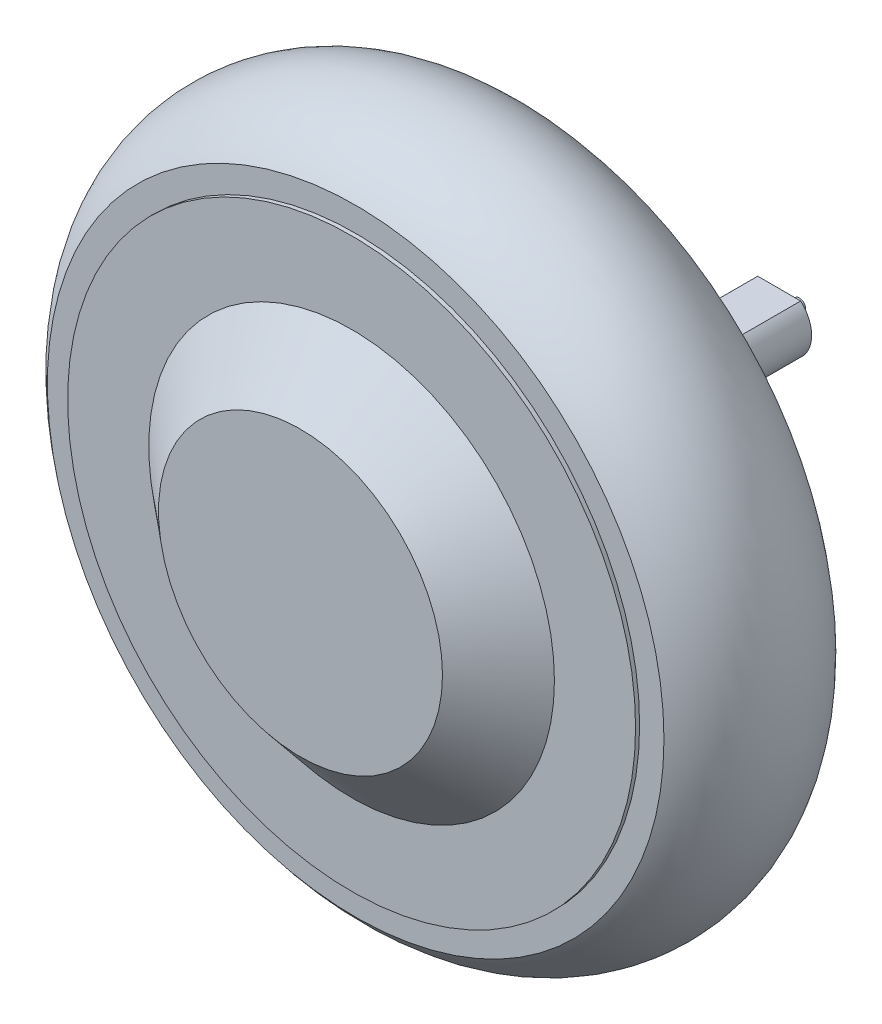
ISO-10303-21;
HEADER;
FILE_DESCRIPTION(('STEP AP214'),'2;1');
FILE_NAME('part.step','',(''),(''),'','','');
FILE_SCHEMA(('AUTOMOTIVE_DESIGN { 1 0 10303 214 1 1 1 1 }'));
ENDSEC;
DATA;
#1=APPLICATION_CONTEXT('core data for automotive mechanical design processes');
#2=APPLICATION_PROTOCOL_DEFINITION('international standard','automotive_design',2000,#1);
#3=PRODUCT_CONTEXT('',#1,'mechanical');
#4=PRODUCT('Part','Part','',(#3));
#5=PRODUCT_RELATED_PRODUCT_CATEGORY('part','',(#4));
#6=PRODUCT_DEFINITION_FORMATION('','',#4);
#7=PRODUCT_DEFINITION_CONTEXT('part definition',#1,'design');
#8=PRODUCT_DEFINITION('design','',#6,#7);
#9=PRODUCT_DEFINITION_SHAPE('','',#8);
#10=(LENGTH_UNIT() NAMED_UNIT(*) SI_UNIT(.MILLI.,.METRE.));
#11=(NAMED_UNIT(*) PLANE_ANGLE_UNIT() SI_UNIT($,.RADIAN.));
#12=(NAMED_UNIT(*) SI_UNIT($,.STERADIAN.) SOLID_ANGLE_UNIT());
#13=UNCERTAINTY_MEASURE_WITH_UNIT(LENGTH_MEASURE(1.E-05),#10,'distance_accuracy_value','');
#14=(GEOMETRIC_REPRESENTATION_CONTEXT(3) GLOBAL_UNCERTAINTY_ASSIGNED_CONTEXT((#13)) GLOBAL_UNIT_ASSIGNED_CONTEXT((#10,
#11,#12)) REPRESENTATION_CONTEXT('',''));
#15=CARTESIAN_POINT('',(0.,0.,0.));
#16=DIRECTION('',(0.,0.,1.));
#17=DIRECTION('',(1.,0.,0.));
#18=AXIS2_PLACEMENT_3D('',#15,#16,#17);
#19=CARTESIAN_POINT('',(0.,0.,0.));
#20=DIRECTION('',(0.,0.,1.));
#21=DIRECTION('',(1.,0.,0.));
#22=AXIS2_PLACEMENT_3D('',#19,#20,#21);
#23=CYLINDRICAL_SURFACE('',#22,8.);
#24=CARTESIAN_POINT('',(0.,0.,-83.4));
#25=DIRECTION('',(0.,0.,1.));
#26=DIRECTION('',(1.,0.,0.));
#27=AXIS2_PLACEMENT_3D('',#24,#25,#26);
#28=CIRCLE('',#27,8.);
#29=CARTESIAN_POINT('',(5.29150262212918,-6.,-83.4));
#30=VERTEX_POINT('',#29);
#31=CARTESIAN_POINT('',(5.29150262212918,6.,-83.4));
#32=VERTEX_POINT('',#31);
#33=EDGE_CURVE('E105',#30,#32,#28,.T.);
#34=ORIENTED_EDGE('',*,*,#33,.T.);
#35=DIRECTION('',(0.,0.,-1.));
#36=VECTOR('',#35,1.);
#37=CARTESIAN_POINT('',(5.29150262212918,6.,-39.629670385731));
#38=LINE('',#37,#36);
#39=CARTESIAN_POINT('',(5.29150262212918,6.,-50.4));
#40=VERTEX_POINT('',#39);
#41=EDGE_CURVE('E64',#40,#32,#38,.T.);
#42=ORIENTED_EDGE('',*,*,#41,.F.);
#43=CARTESIAN_POINT('',(0.,0.,-50.4));
#44=DIRECTION('',(0.,0.,1.));
#45=DIRECTION('',(1.,0.,0.));
#46=AXIS2_PLACEMENT_3D('',#43,#44,#45);
#47=CIRCLE('',#46,8.);
#48=CARTESIAN_POINT('',(5.29150262212918,-6.,-50.4));
#49=VERTEX_POINT('',#48);
#50=EDGE_CURVE('E95',#49,#40,#47,.T.);
#51=ORIENTED_EDGE('',*,*,#50,.F.);
#52=DIRECTION('',(0.,0.,-1.));
#53=VECTOR('',#52,1.);
#54=CARTESIAN_POINT('',(5.29150262212918,-6.,-39.629670385731));
#55=LINE('',#54,#53);
#56=EDGE_CURVE('E172',#49,#30,#55,.T.);
#57=ORIENTED_EDGE('',*,*,#56,.T.);
#58=EDGE_LOOP('',(#34,#42,#51,#57));
#59=FACE_BOUND('',#58,.T.);
#60=ADVANCED_FACE('F41',(#59),#23,.T.);
#61=CARTESIAN_POINT('',(0.,0.,34.6));
#62=DIRECTION('',(0.,0.,-1.));
#63=DIRECTION('',(-1.,0.,0.));
#64=AXIS2_PLACEMENT_3D('',#61,#62,#63);
#65=PLANE('',#64);
#66=CARTESIAN_POINT('',(0.,0.,34.6));
#67=DIRECTION('',(0.,0.,1.));
#68=DIRECTION('',(1.,0.,0.));
#69=AXIS2_PLACEMENT_3D('',#66,#67,#68);
#70=CIRCLE('',#69,35.);
#71=CARTESIAN_POINT('',(35.,0.,34.6));
#72=VERTEX_POINT('',#71);
#73=EDGE_CURVE('E155',#72,#72,#70,.T.);
#74=ORIENTED_EDGE('',*,*,#73,.T.);
#75=EDGE_LOOP('',(#74));
#76=FACE_BOUND('',#75,.T.);
#77=ADVANCED_FACE('F43',(#76),#65,.F.);
#78=CARTESIAN_POINT('',(0.,0.,22.));
#79=DIRECTION('',(0.,0.,-1.));
#80=DIRECTION('',(-1.,0.,0.));
#81=AXIS2_PLACEMENT_3D('',#78,#79,#80);
#82=CONICAL_SURFACE('',#81,50.,0.872136502073434);
#83=ORIENTED_EDGE('',*,*,#73,.F.);
#84=EDGE_LOOP('',(#83));
#85=FACE_BOUND('',#84,.T.);
#86=CARTESIAN_POINT('',(0.,0.,22.));
#87=DIRECTION('',(0.,0.,1.));
#88=DIRECTION('',(1.,0.,0.));
#89=AXIS2_PLACEMENT_3D('',#86,#87,#88);
#90=CIRCLE('',#89,50.);
#91=CARTESIAN_POINT('',(50.,0.,22.));
#92=VERTEX_POINT('',#91);
#93=EDGE_CURVE('E152',#92,#92,#90,.T.);
#94=ORIENTED_EDGE('',*,*,#93,.T.);
#95=EDGE_LOOP('',(#94));
#96=FACE_BOUND('',#95,.T.);
#97=ADVANCED_FACE('F195',(#85,#96),#82,.T.);
#98=CARTESIAN_POINT('',(0.,50.,22.));
#99=DIRECTION('',(0.,0.,-1.));
#100=DIRECTION('',(-1.,0.,0.));
#101=AXIS2_PLACEMENT_3D('',#98,#99,#100);
#102=PLANE('',#101);
#103=ORIENTED_EDGE('',*,*,#93,.F.);
#104=EDGE_LOOP('',(#103));
#105=FACE_BOUND('',#104,.T.);
#106=CARTESIAN_POINT('',(0.,0.,22.));
#107=DIRECTION('',(0.,0.,1.));
#108=DIRECTION('',(1.,0.,0.));
#109=AXIS2_PLACEMENT_3D('',#106,#107,#108);
#110=CIRCLE('',#109,70.);
#111=CARTESIAN_POINT('',(70.,0.,22.));
#112=VERTEX_POINT('',#111);
#113=EDGE_CURVE('E149',#112,#112,#110,.T.);
#114=ORIENTED_EDGE('',*,*,#113,.T.);
#115=EDGE_LOOP('',(#114));
#116=FACE_BOUND('',#115,.T.);
#117=ADVANCED_FACE('F266',(#105,#116),#102,.F.);
#118=CARTESIAN_POINT('',(0.,0.,0.));
#119=DIRECTION('',(0.,0.,1.));
#120=DIRECTION('',(1.,0.,0.));
#121=AXIS2_PLACEMENT_3D('',#118,#119,#120);
#122=CYLINDRICAL_SURFACE('',#121,70.);
#123=ORIENTED_EDGE('',*,*,#113,.F.);
#124=EDGE_LOOP('',(#123));
#125=FACE_BOUND('',#124,.T.);
#126=CARTESIAN_POINT('',(0.,0.,21.));
#127=DIRECTION('',(0.,0.,1.));
#128=DIRECTION('',(1.,0.,0.));
#129=AXIS2_PLACEMENT_3D('',#126,#127,#128);
#130=CIRCLE('',#129,70.);
#131=CARTESIAN_POINT('',(70.,0.,21.));
#132=VERTEX_POINT('',#131);
#133=EDGE_CURVE('E146',#132,#132,#130,.T.);
#134=ORIENTED_EDGE('',*,*,#133,.T.);
#135=EDGE_LOOP('',(#134));
#136=FACE_BOUND('',#135,.T.);
#137=ADVANCED_FACE('F262',(#125,#136),#122,.T.);
#138=CARTESIAN_POINT('',(0.,70.,21.));
#139=DIRECTION('',(0.,0.,-1.));
#140=DIRECTION('',(-1.,0.,0.));
#141=AXIS2_PLACEMENT_3D('',#138,#139,#140);
#142=PLANE('',#141);
#143=ORIENTED_EDGE('',*,*,#133,.F.);
#144=EDGE_LOOP('',(#143));
#145=FACE_BOUND('',#144,.T.);
#146=CARTESIAN_POINT('',(0.,0.,21.));
#147=DIRECTION('',(0.,0.,1.));
#148=DIRECTION('',(1.,0.,0.));
#149=AXIS2_PLACEMENT_3D('',#146,#147,#148);
#150=CIRCLE('',#149,76.);
#151=CARTESIAN_POINT('',(76.,0.,21.));
#152=VERTEX_POINT('',#151);
#153=EDGE_CURVE('E143',#152,#152,#150,.T.);
#154=ORIENTED_EDGE('',*,*,#153,.T.);
#155=EDGE_LOOP('',(#154));
#156=FACE_BOUND('',#155,.T.);
#157=ADVANCED_FACE('F258',(#145,#156),#142,.F.);
#158=CARTESIAN_POINT('',(0.,0.,0.));
#159=DIRECTION('',(0.,0.,1.));
#160=DIRECTION('',(1.,0.,0.));
#161=AXIS2_PLACEMENT_3D('',#158,#159,#160);
#162=TOROIDAL_SURFACE('',#161,60.25,26.25);
#163=ORIENTED_EDGE('',*,*,#153,.F.);
#164=EDGE_LOOP('',(#163));
#165=FACE_BOUND('',#164,.T.);
#166=CARTESIAN_POINT('',(0.,0.,-21.));
#167=DIRECTION('',(0.,0.,1.));
#168=DIRECTION('',(1.,0.,0.));
#169=AXIS2_PLACEMENT_3D('',#166,#167,#168);
#170=CIRCLE('',#169,76.);
#171=CARTESIAN_POINT('',(76.,0.,-21.));
#172=VERTEX_POINT('',#171);
#173=EDGE_CURVE('E140',#172,#172,#170,.T.);
#174=ORIENTED_EDGE('',*,*,#173,.T.);
#175=EDGE_LOOP('',(#174));
#176=FACE_BOUND('',#175,.T.);
#177=ADVANCED_FACE('F254',(#165,#176),#162,.T.);
#178=CARTESIAN_POINT('',(0.,70.,-21.));
#179=DIRECTION('',(0.,0.,1.));
#180=DIRECTION('',(1.,0.,0.));
#181=AXIS2_PLACEMENT_3D('',#178,#179,#180);
#182=PLANE('',#181);
#183=ORIENTED_EDGE('',*,*,#173,.F.);
#184=EDGE_LOOP('',(#183));
#185=FACE_BOUND('',#184,.T.);
#186=CARTESIAN_POINT('',(0.,0.,-21.));
#187=DIRECTION('',(0.,0.,1.));
#188=DIRECTION('',(1.,0.,0.));
#189=AXIS2_PLACEMENT_3D('',#186,#187,#188);
#190=CIRCLE('',#189,70.);
#191=CARTESIAN_POINT('',(70.,0.,-21.));
#192=VERTEX_POINT('',#191);
#193=EDGE_CURVE('E137',#192,#192,#190,.T.);
#194=ORIENTED_EDGE('',*,*,#193,.T.);
#195=EDGE_LOOP('',(#194));
#196=FACE_BOUND('',#195,.T.);
#197=ADVANCED_FACE('F250',(#185,#196),#182,.F.);
#198=CARTESIAN_POINT('',(0.,0.,0.));
#199=DIRECTION('',(0.,0.,1.));
#200=DIRECTION('',(1.,0.,0.));
#201=AXIS2_PLACEMENT_3D('',#198,#199,#200);
#202=CYLINDRICAL_SURFACE('',#201,70.);
#203=ORIENTED_EDGE('',*,*,#193,.F.);
#204=EDGE_LOOP('',(#203));
#205=FACE_BOUND('',#204,.T.);
#206=CARTESIAN_POINT('',(0.,0.,-22.));
#207=DIRECTION('',(0.,0.,1.));
#208=DIRECTION('',(1.,0.,0.));
#209=AXIS2_PLACEMENT_3D('',#206,#207,#208);
#210=CIRCLE('',#209,70.);
#211=CARTESIAN_POINT('',(70.,0.,-22.));
#212=VERTEX_POINT('',#211);
#213=EDGE_CURVE('E134',#212,#212,#210,.T.);
#214=ORIENTED_EDGE('',*,*,#213,.T.);
#215=EDGE_LOOP('',(#214));
#216=FACE_BOUND('',#215,.T.);
#217=ADVANCED_FACE('F246',(#205,#216),#202,.T.);
#218=CARTESIAN_POINT('',(0.,50.,-22.));
#219=DIRECTION('',(0.,0.,1.));
#220=DIRECTION('',(1.,0.,0.));
#221=AXIS2_PLACEMENT_3D('',#218,#219,#220);
#222=PLANE('',#221);
#223=ORIENTED_EDGE('',*,*,#213,.F.);
#224=EDGE_LOOP('',(#223));
#225=FACE_BOUND('',#224,.T.);
#226=CARTESIAN_POINT('',(0.,0.,-22.));
#227=DIRECTION('',(0.,0.,1.));
#228=DIRECTION('',(1.,0.,0.));
#229=AXIS2_PLACEMENT_3D('',#226,#227,#228);
#230=CIRCLE('',#229,50.);
#231=CARTESIAN_POINT('',(50.,0.,-22.));
#232=VERTEX_POINT('',#231);
#233=EDGE_CURVE('E131',#232,#232,#230,.T.);
#234=ORIENTED_EDGE('',*,*,#233,.T.);
#235=EDGE_LOOP('',(#234));
#236=FACE_BOUND('',#235,.T.);
#237=ADVANCED_FACE('F242',(#225,#236),#222,.F.);
#238=CARTESIAN_POINT('',(0.,0.,-34.6));
#239=DIRECTION('',(0.,0.,1.));
#240=DIRECTION('',(1.,0.,0.));
#241=AXIS2_PLACEMENT_3D('',#238,#239,#240);
#242=CONICAL_SURFACE('',#241,35.,0.872136502073434);
#243=ORIENTED_EDGE('',*,*,#233,.F.);
#244=EDGE_LOOP('',(#243));
#245=FACE_BOUND('',#244,.T.);
#246=CARTESIAN_POINT('',(0.,0.,-34.6));
#247=DIRECTION('',(0.,0.,1.));
#248=DIRECTION('',(1.,0.,0.));
#249=AXIS2_PLACEMENT_3D('',#246,#247,#248);
#250=CIRCLE('',#249,35.);
#251=CARTESIAN_POINT('',(35.,0.,-34.6));
#252=VERTEX_POINT('',#251);
#253=EDGE_CURVE('E128',#252,#252,#250,.T.);
#254=ORIENTED_EDGE('',*,*,#253,.T.);
#255=EDGE_LOOP('',(#254));
#256=FACE_BOUND('',#255,.T.);
#257=ADVANCED_FACE('F238',(#245,#256),#242,.T.);
#258=CARTESIAN_POINT('',(0.,25.,-34.6));
#259=DIRECTION('',(0.,0.,1.));
#260=DIRECTION('',(1.,0.,0.));
#261=AXIS2_PLACEMENT_3D('',#258,#259,#260);
#262=PLANE('',#261);
#263=ORIENTED_EDGE('',*,*,#253,.F.);
#264=EDGE_LOOP('',(#263));
#265=FACE_BOUND('',#264,.T.);
#266=CARTESIAN_POINT('',(0.,0.,-34.6));
#267=DIRECTION('',(0.,0.,1.));
#268=DIRECTION('',(1.,0.,0.));
#269=AXIS2_PLACEMENT_3D('',#266,#267,#268);
#270=CIRCLE('',#269,25.);
#271=CARTESIAN_POINT('',(25.,0.,-34.6));
#272=VERTEX_POINT('',#271);
#273=EDGE_CURVE('E125',#272,#272,#270,.T.);
#274=ORIENTED_EDGE('',*,*,#273,.T.);
#275=EDGE_LOOP('',(#274));
#276=FACE_BOUND('',#275,.T.);
#277=ADVANCED_FACE('F234',(#265,#276),#262,.F.);
#278=CARTESIAN_POINT('',(0.,0.,-40.4));
#279=DIRECTION('',(0.,0.,1.));
#280=DIRECTION('',(1.,0.,0.));
#281=AXIS2_PLACEMENT_3D('',#278,#279,#280);
#282=CONICAL_SURFACE('',#281,19.1999999999999,0.785398163397452);
#283=ORIENTED_EDGE('',*,*,#273,.F.);
#284=EDGE_LOOP('',(#283));
#285=FACE_BOUND('',#284,.T.);
#286=CARTESIAN_POINT('',(0.,0.,-40.4));
#287=DIRECTION('',(0.,0.,1.));
#288=DIRECTION('',(1.,0.,0.));
#289=AXIS2_PLACEMENT_3D('',#286,#287,#288);
#290=CIRCLE('',#289,19.1999999999999);
#291=CARTESIAN_POINT('',(19.1999999999999,0.,-40.4));
#292=VERTEX_POINT('',#291);
#293=EDGE_CURVE('E122',#292,#292,#290,.T.);
#294=ORIENTED_EDGE('',*,*,#293,.T.);
#295=EDGE_LOOP('',(#294));
#296=FACE_BOUND('',#295,.T.);
#297=ADVANCED_FACE('F230',(#285,#296),#282,.T.);
#298=CARTESIAN_POINT('',(0.,19.1999999999999,-40.4));
#299=DIRECTION('',(0.,0.,1.));
#300=DIRECTION('',(1.,0.,0.));
#301=AXIS2_PLACEMENT_3D('',#298,#299,#300);
#302=PLANE('',#301);
#303=ORIENTED_EDGE('',*,*,#293,.F.);
#304=EDGE_LOOP('',(#303));
#305=FACE_BOUND('',#304,.T.);
#306=CARTESIAN_POINT('',(0.,0.,-40.4));
#307=DIRECTION('',(0.,0.,1.));
#308=DIRECTION('',(1.,0.,0.));
#309=AXIS2_PLACEMENT_3D('',#306,#307,#308);
#310=CIRCLE('',#309,12.);
#311=CARTESIAN_POINT('',(12.,0.,-40.4));
#312=VERTEX_POINT('',#311);
#313=EDGE_CURVE('E119',#312,#312,#310,.T.);
#314=ORIENTED_EDGE('',*,*,#313,.T.);
#315=EDGE_LOOP('',(#314));
#316=FACE_BOUND('',#315,.T.);
#317=ADVANCED_FACE('F226',(#305,#316),#302,.F.);
#318=CARTESIAN_POINT('',(0.,0.,0.));
#319=DIRECTION('',(0.,0.,1.));
#320=DIRECTION('',(1.,0.,0.));
#321=AXIS2_PLACEMENT_3D('',#318,#319,#320);
#322=CYLINDRICAL_SURFACE('',#321,12.);
#323=ORIENTED_EDGE('',*,*,#313,.F.);
#324=EDGE_LOOP('',(#323));
#325=FACE_BOUND('',#324,.T.);
#326=CARTESIAN_POINT('',(0.,0.,-45.4));
#327=DIRECTION('',(0.,0.,1.));
#328=DIRECTION('',(1.,0.,0.));
#329=AXIS2_PLACEMENT_3D('',#326,#327,#328);
#330=CIRCLE('',#329,12.);
#331=CARTESIAN_POINT('',(12.,0.,-45.4));
#332=VERTEX_POINT('',#331);
#333=EDGE_CURVE('E116',#332,#332,#330,.T.);
#334=ORIENTED_EDGE('',*,*,#333,.T.);
#335=EDGE_LOOP('',(#334));
#336=FACE_BOUND('',#335,.T.);
#337=ADVANCED_FACE('F222',(#325,#336),#322,.T.);
#338=CARTESIAN_POINT('',(0.,12.,-45.4));
#339=DIRECTION('',(0.,0.,-1.));
#340=DIRECTION('',(-1.,0.,0.));
#341=AXIS2_PLACEMENT_3D('',#338,#339,#340);
#342=PLANE('',#341);
#343=ORIENTED_EDGE('',*,*,#333,.F.);
#344=EDGE_LOOP('',(#343));
#345=FACE_BOUND('',#344,.T.);
#346=CARTESIAN_POINT('',(0.,0.,-45.4));
#347=DIRECTION('',(0.,0.,1.));
#348=DIRECTION('',(1.,0.,0.));
#349=AXIS2_PLACEMENT_3D('',#346,#347,#348);
#350=CIRCLE('',#349,14.);
#351=CARTESIAN_POINT('',(14.,0.,-45.4));
#352=VERTEX_POINT('',#351);
#353=EDGE_CURVE('E113',#352,#352,#350,.T.);
#354=ORIENTED_EDGE('',*,*,#353,.T.);
#355=EDGE_LOOP('',(#354));
#356=FACE_BOUND('',#355,.T.);
#357=ADVANCED_FACE('F218',(#345,#356),#342,.F.);
#358=CARTESIAN_POINT('',(0.,0.,0.));
#359=DIRECTION('',(0.,0.,1.));
#360=DIRECTION('',(1.,0.,0.));
#361=AXIS2_PLACEMENT_3D('',#358,#359,#360);
#362=CYLINDRICAL_SURFACE('',#361,14.);
#363=ORIENTED_EDGE('',*,*,#353,.F.);
#364=EDGE_LOOP('',(#363));
#365=FACE_BOUND('',#364,.T.);
#366=CARTESIAN_POINT('',(0.,0.,-48.4));
#367=DIRECTION('',(0.,0.,1.));
#368=DIRECTION('',(1.,0.,0.));
#369=AXIS2_PLACEMENT_3D('',#366,#367,#368);
#370=CIRCLE('',#369,14.);
#371=CARTESIAN_POINT('',(14.,0.,-48.4));
#372=VERTEX_POINT('',#371);
#373=EDGE_CURVE('E110',#372,#372,#370,.T.);
#374=ORIENTED_EDGE('',*,*,#373,.T.);
#375=EDGE_LOOP('',(#374));
#376=FACE_BOUND('',#375,.T.);
#377=ADVANCED_FACE('F214',(#365,#376),#362,.T.);
#378=CARTESIAN_POINT('',(0.,14.,-48.4));
#379=DIRECTION('',(0.,0.,-1.));
#380=DIRECTION('',(-1.,0.,0.));
#381=AXIS2_PLACEMENT_3D('',#378,#379,#380);
#382=PLANE('',#381);
#383=ORIENTED_EDGE('',*,*,#373,.F.);
#384=EDGE_LOOP('',(#383));
#385=FACE_BOUND('',#384,.T.);
#386=CARTESIAN_POINT('',(0.,0.,-48.4));
#387=DIRECTION('',(0.,0.,1.));
#388=DIRECTION('',(1.,0.,0.));
#389=AXIS2_PLACEMENT_3D('',#386,#387,#388);
#390=CIRCLE('',#389,16.);
#391=CARTESIAN_POINT('',(16.,0.,-48.4));
#392=VERTEX_POINT('',#391);
#393=EDGE_CURVE('E101',#392,#392,#390,.T.);
#394=ORIENTED_EDGE('',*,*,#393,.T.);
#395=EDGE_LOOP('',(#394));
#396=FACE_BOUND('',#395,.T.);
#397=ADVANCED_FACE('F207',(#385,#396),#382,.F.);
#398=CARTESIAN_POINT('',(0.,0.,0.));
#399=DIRECTION('',(0.,0.,1.));
#400=DIRECTION('',(1.,0.,0.));
#401=AXIS2_PLACEMENT_3D('',#398,#399,#400);
#402=CYLINDRICAL_SURFACE('',#401,16.);
#403=ORIENTED_EDGE('',*,*,#393,.F.);
#404=EDGE_LOOP('',(#403));
#405=FACE_BOUND('',#404,.T.);
#406=CARTESIAN_POINT('',(0.,0.,-50.4));
#407=DIRECTION('',(0.,0.,1.));
#408=DIRECTION('',(1.,0.,0.));
#409=AXIS2_PLACEMENT_3D('',#406,#407,#408);
#410=CIRCLE('',#409,16.);
#411=CARTESIAN_POINT('',(16.,0.,-50.4));
#412=VERTEX_POINT('',#411);
#413=EDGE_CURVE('E98',#412,#412,#410,.T.);
#414=ORIENTED_EDGE('',*,*,#413,.T.);
#415=EDGE_LOOP('',(#414));
#416=FACE_BOUND('',#415,.T.);
#417=ADVANCED_FACE('F202',(#405,#416),#402,.T.);
#418=CARTESIAN_POINT('',(0.,16.,-50.4));
#419=DIRECTION('',(0.,0.,1.));
#420=DIRECTION('',(1.,0.,0.));
#421=AXIS2_PLACEMENT_3D('',#418,#419,#420);
#422=PLANE('',#421);
#423=ORIENTED_EDGE('',*,*,#413,.F.);
#424=EDGE_LOOP('',(#423));
#425=FACE_BOUND('',#424,.T.);
#426=ORIENTED_EDGE('',*,*,#50,.T.);
#427=DIRECTION('',(-1.,0.,0.));
#428=VECTOR('',#427,1.);
#429=CARTESIAN_POINT('',(5.29150262212918,6.,-50.4));
#430=LINE('',#429,#428);
#431=CARTESIAN_POINT('',(-5.29150262212918,6.,-50.4));
#432=VERTEX_POINT('',#431);
#433=EDGE_CURVE('E82',#40,#432,#430,.T.);
#434=ORIENTED_EDGE('',*,*,#433,.T.);
#435=CARTESIAN_POINT('',(-5.29150262212918,-6.,-50.4));
#436=VERTEX_POINT('',#435);
#437=EDGE_CURVE('E93',#432,#436,#47,.T.);
#438=ORIENTED_EDGE('',*,*,#437,.T.);
#439=DIRECTION('',(1.,0.,0.));
#440=VECTOR('',#439,1.);
#441=CARTESIAN_POINT('',(5.29150262212918,-6.,-50.4));
#442=LINE('',#441,#440);
#443=EDGE_CURVE('E174',#436,#49,#442,.T.);
#444=ORIENTED_EDGE('',*,*,#443,.T.);
#445=EDGE_LOOP('',(#426,#434,#438,#444));
#446=FACE_BOUND('',#445,.T.);
#447=ADVANCED_FACE('F91',(#425,#446),#422,.F.);
#448=ORIENTED_EDGE('',*,*,#437,.F.);
#449=DIRECTION('',(0.,0.,-1.));
#450=VECTOR('',#449,1.);
#451=CARTESIAN_POINT('',(-5.29150262212918,6.,-39.629670385731));
#452=LINE('',#451,#450);
#453=CARTESIAN_POINT('',(-5.29150262212918,6.,-83.4));
#454=VERTEX_POINT('',#453);
#455=EDGE_CURVE('E79',#432,#454,#452,.T.);
#456=ORIENTED_EDGE('',*,*,#455,.T.);
#457=CARTESIAN_POINT('',(-5.29150262212918,-6.,-83.4));
#458=VERTEX_POINT('',#457);
#459=EDGE_CURVE('E103',#454,#458,#28,.T.);
#460=ORIENTED_EDGE('',*,*,#459,.T.);
#461=DIRECTION('',(0.,0.,-1.));
#462=VECTOR('',#461,1.);
#463=CARTESIAN_POINT('',(-5.29150262212918,-6.,-39.629670385731));
#464=LINE('',#463,#462);
#465=EDGE_CURVE('E56',#436,#458,#464,.T.);
#466=ORIENTED_EDGE('',*,*,#465,.F.);
#467=EDGE_LOOP('',(#448,#456,#460,#466));
#468=FACE_BOUND('',#467,.T.);
#469=ADVANCED_FACE('F97',(#468),#23,.T.);
#470=CARTESIAN_POINT('',(0.,1.5,-83.4));
#471=DIRECTION('',(0.,0.,1.));
#472=DIRECTION('',(1.,0.,0.));
#473=AXIS2_PLACEMENT_3D('',#470,#471,#472);
#474=PLANE('',#473);
#475=ORIENTED_EDGE('',*,*,#459,.F.);
#476=DIRECTION('',(1.,0.,0.));
#477=VECTOR('',#476,1.);
#478=CARTESIAN_POINT('',(0.,6.,-83.4));
#479=LINE('',#478,#477);
#480=EDGE_CURVE('E11',#454,#32,#479,.T.);
#481=ORIENTED_EDGE('',*,*,#480,.T.);
#482=ORIENTED_EDGE('',*,*,#33,.F.);
#483=DIRECTION('',(-1.,0.,0.));
#484=VECTOR('',#483,1.);
#485=CARTESIAN_POINT('',(0.,-6.,-83.4));
#486=LINE('',#485,#484);
#487=EDGE_CURVE('E49',#30,#458,#486,.T.);
#488=ORIENTED_EDGE('',*,*,#487,.T.);
#489=EDGE_LOOP('',(#475,#481,#482,#488));
#490=FACE_BOUND('',#489,.T.);
#491=CARTESIAN_POINT('',(0.,0.,-83.4));
#492=DIRECTION('',(0.,0.,1.));
#493=DIRECTION('',(1.,0.,0.));
#494=AXIS2_PLACEMENT_3D('',#491,#492,#493);
#495=CIRCLE('',#494,1.5);
#496=CARTESIAN_POINT('',(1.5,0.,-83.4));
#497=VERTEX_POINT('',#496);
#498=EDGE_CURVE('E163',#497,#497,#495,.T.);
#499=ORIENTED_EDGE('',*,*,#498,.T.);
#500=EDGE_LOOP('',(#499));
#501=FACE_BOUND('',#500,.T.);
#502=ADVANCED_FACE('F159',(#490,#501),#474,.F.);
#503=CARTESIAN_POINT('',(0.,0.,0.));
#504=DIRECTION('',(0.,0.,1.));
#505=DIRECTION('',(1.,0.,0.));
#506=AXIS2_PLACEMENT_3D('',#503,#504,#505);
#507=CYLINDRICAL_SURFACE('',#506,1.5);
#508=ORIENTED_EDGE('',*,*,#498,.F.);
#509=EDGE_LOOP('',(#508));
#510=FACE_BOUND('',#509,.T.);
#511=CARTESIAN_POINT('',(0.,0.,-88.4));
#512=DIRECTION('',(0.,0.,1.));
#513=DIRECTION('',(1.,0.,0.));
#514=AXIS2_PLACEMENT_3D('',#511,#512,#513);
#515=CIRCLE('',#514,1.5);
#516=CARTESIAN_POINT('',(1.5,0.,-88.4));
#517=VERTEX_POINT('',#516);
#518=EDGE_CURVE('E166',#517,#517,#515,.T.);
#519=ORIENTED_EDGE('',*,*,#518,.T.);
#520=EDGE_LOOP('',(#519));
#521=FACE_BOUND('',#520,.T.);
#522=ADVANCED_FACE('F186',(#510,#521),#507,.T.);
#523=CARTESIAN_POINT('',(0.,1.5,-88.4));
#524=DIRECTION('',(0.,0.,1.));
#525=DIRECTION('',(1.,0.,0.));
#526=AXIS2_PLACEMENT_3D('',#523,#524,#525);
#527=PLANE('',#526);
#528=ORIENTED_EDGE('',*,*,#518,.F.);
#529=EDGE_LOOP('',(#528));
#530=FACE_BOUND('',#529,.T.);
#531=ADVANCED_FACE('F178',(#530),#527,.F.);
#532=CARTESIAN_POINT('',(5.29150262212918,-6.,-39.629670385731));
#533=DIRECTION('',(0.,1.,0.));
#534=DIRECTION('',(0.,0.,1.));
#535=AXIS2_PLACEMENT_3D('',#532,#533,#534);
#536=PLANE('',#535);
#537=ORIENTED_EDGE('',*,*,#56,.F.);
#538=ORIENTED_EDGE('',*,*,#443,.F.);
#539=ORIENTED_EDGE('',*,*,#465,.T.);
#540=ORIENTED_EDGE('',*,*,#487,.F.);
#541=EDGE_LOOP('',(#537,#538,#539,#540));
#542=FACE_BOUND('',#541,.T.);
#543=ADVANCED_FACE('F176',(#542),#536,.F.);
#544=CARTESIAN_POINT('',(5.29150262212918,6.,-39.629670385731));
#545=DIRECTION('',(0.,-1.,0.));
#546=DIRECTION('',(0.,0.,-1.));
#547=AXIS2_PLACEMENT_3D('',#544,#545,#546);
#548=PLANE('',#547);
#549=ORIENTED_EDGE('',*,*,#455,.F.);
#550=ORIENTED_EDGE('',*,*,#433,.F.);
#551=ORIENTED_EDGE('',*,*,#41,.T.);
#552=ORIENTED_EDGE('',*,*,#480,.F.);
#553=EDGE_LOOP('',(#549,#550,#551,#552));
#554=FACE_BOUND('',#553,.T.);
#555=ADVANCED_FACE('F81',(#554),#548,.F.);
#556=CLOSED_SHELL('',(#60,#77,#97,#117,#137,#157,#177,#197,#217,#237,#257,#277,#297,#317,#337,
#357,#377,#397,#417,#447,#469,#502,#522,#531,#543,#555));
#557=MANIFOLD_SOLID_BREP('B2',#556);
#558=ADVANCED_BREP_SHAPE_REPRESENTATION('',(#18,#557),#14);
#559=SHAPE_DEFINITION_REPRESENTATION(#9,#558);
ENDSEC;
END-ISO-10303-21;
